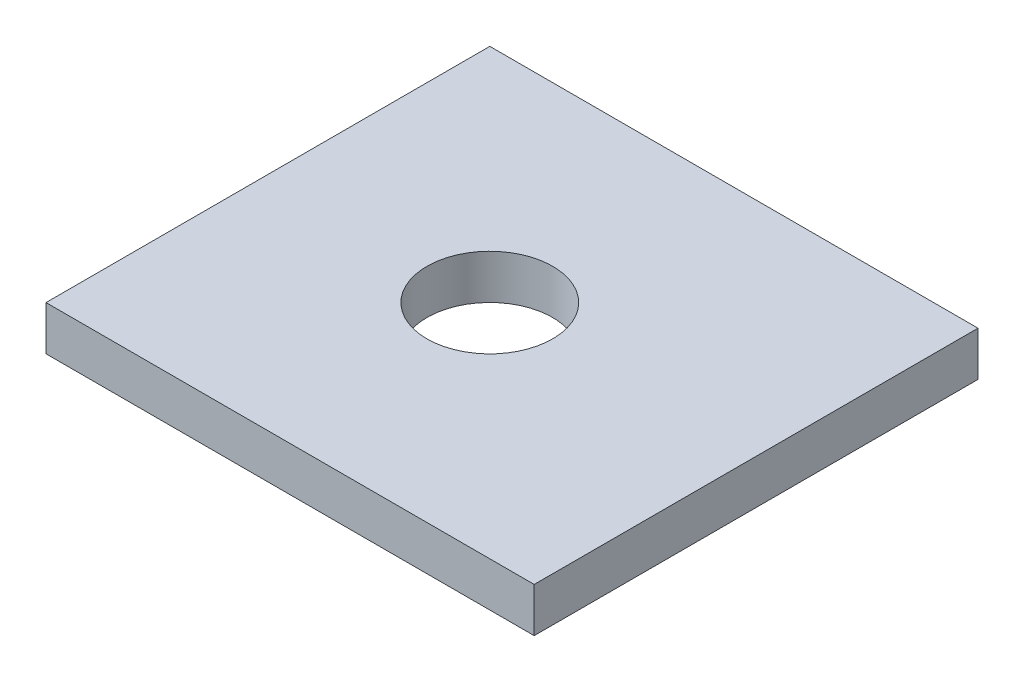
ISO-10303-21;
HEADER;
FILE_DESCRIPTION(('STEP AP214'),'2;1');
FILE_NAME('part.step','',(''),(''),'','','');
FILE_SCHEMA(('AUTOMOTIVE_DESIGN { 1 0 10303 214 1 1 1 1 }'));
ENDSEC;
DATA;
#1=APPLICATION_CONTEXT('core data for automotive mechanical design processes');
#2=APPLICATION_PROTOCOL_DEFINITION('international standard','automotive_design',2000,#1);
#3=PRODUCT_CONTEXT('',#1,'mechanical');
#4=PRODUCT('Part','Part','',(#3));
#5=PRODUCT_RELATED_PRODUCT_CATEGORY('part','',(#4));
#6=PRODUCT_DEFINITION_FORMATION('','',#4);
#7=PRODUCT_DEFINITION_CONTEXT('part definition',#1,'design');
#8=PRODUCT_DEFINITION('design','',#6,#7);
#9=PRODUCT_DEFINITION_SHAPE('','',#8);
#10=(LENGTH_UNIT() NAMED_UNIT(*) SI_UNIT(.MILLI.,.METRE.));
#11=(NAMED_UNIT(*) PLANE_ANGLE_UNIT() SI_UNIT($,.RADIAN.));
#12=(NAMED_UNIT(*) SI_UNIT($,.STERADIAN.) SOLID_ANGLE_UNIT());
#13=UNCERTAINTY_MEASURE_WITH_UNIT(LENGTH_MEASURE(1.E-05),#10,'distance_accuracy_value','');
#14=(GEOMETRIC_REPRESENTATION_CONTEXT(3) GLOBAL_UNCERTAINTY_ASSIGNED_CONTEXT((#13)) GLOBAL_UNIT_ASSIGNED_CONTEXT((#10,
#11,#12)) REPRESENTATION_CONTEXT('',''));
#15=CARTESIAN_POINT('',(0.,0.,0.));
#16=DIRECTION('',(0.,0.,1.));
#17=DIRECTION('',(1.,0.,0.));
#18=AXIS2_PLACEMENT_3D('',#15,#16,#17);
#19=CARTESIAN_POINT('',(16.5,3.,-15.));
#20=DIRECTION('',(-1.,0.,0.));
#21=DIRECTION('',(0.,0.,1.));
#22=AXIS2_PLACEMENT_3D('',#19,#20,#21);
#23=PLANE('',#22);
#24=DIRECTION('',(0.,0.,-1.));
#25=VECTOR('',#24,1.);
#26=CARTESIAN_POINT('',(16.5,0.,-15.));
#27=LINE('',#26,#25);
#28=CARTESIAN_POINT('',(16.5,0.,15.));
#29=VERTEX_POINT('',#28);
#30=CARTESIAN_POINT('',(16.5,0.,-15.));
#31=VERTEX_POINT('',#30);
#32=EDGE_CURVE('E107',#29,#31,#27,.T.);
#33=ORIENTED_EDGE('',*,*,#32,.T.);
#34=DIRECTION('',(0.,-1.,0.));
#35=VECTOR('',#34,1.);
#36=CARTESIAN_POINT('',(16.5,3.,-15.));
#37=LINE('',#36,#35);
#38=CARTESIAN_POINT('',(16.5,3.,-15.));
#39=VERTEX_POINT('',#38);
#40=EDGE_CURVE('E11',#39,#31,#37,.T.);
#41=ORIENTED_EDGE('',*,*,#40,.F.);
#42=DIRECTION('',(0.,0.,-1.));
#43=VECTOR('',#42,1.);
#44=CARTESIAN_POINT('',(16.5,3.,-15.));
#45=LINE('',#44,#43);
#46=CARTESIAN_POINT('',(16.5,3.,15.));
#47=VERTEX_POINT('',#46);
#48=EDGE_CURVE('E91',#47,#39,#45,.T.);
#49=ORIENTED_EDGE('',*,*,#48,.F.);
#50=DIRECTION('',(0.,-1.,0.));
#51=VECTOR('',#50,1.);
#52=CARTESIAN_POINT('',(16.5,3.,15.));
#53=LINE('',#52,#51);
#54=EDGE_CURVE('E103',#47,#29,#53,.T.);
#55=ORIENTED_EDGE('',*,*,#54,.T.);
#56=EDGE_LOOP('',(#33,#41,#49,#55));
#57=FACE_BOUND('',#56,.T.);
#58=ADVANCED_FACE('F39',(#57),#23,.F.);
#59=CARTESIAN_POINT('',(-16.5,3.,-15.));
#60=DIRECTION('',(0.,0.,1.));
#61=DIRECTION('',(1.,0.,0.));
#62=AXIS2_PLACEMENT_3D('',#59,#60,#61);
#63=PLANE('',#62);
#64=DIRECTION('',(-1.,0.,0.));
#65=VECTOR('',#64,1.);
#66=CARTESIAN_POINT('',(-16.5,0.,-15.));
#67=LINE('',#66,#65);
#68=CARTESIAN_POINT('',(-16.5,0.,-15.));
#69=VERTEX_POINT('',#68);
#70=EDGE_CURVE('E96',#31,#69,#67,.T.);
#71=ORIENTED_EDGE('',*,*,#70,.T.);
#72=DIRECTION('',(0.,-1.,0.));
#73=VECTOR('',#72,1.);
#74=CARTESIAN_POINT('',(-16.5,3.,-15.));
#75=LINE('',#74,#73);
#76=CARTESIAN_POINT('',(-16.5,3.,-15.));
#77=VERTEX_POINT('',#76);
#78=EDGE_CURVE('E48',#77,#69,#75,.T.);
#79=ORIENTED_EDGE('',*,*,#78,.F.);
#80=DIRECTION('',(-1.,0.,0.));
#81=VECTOR('',#80,1.);
#82=CARTESIAN_POINT('',(-16.5,3.,-15.));
#83=LINE('',#82,#81);
#84=EDGE_CURVE('E86',#39,#77,#83,.T.);
#85=ORIENTED_EDGE('',*,*,#84,.F.);
#86=ORIENTED_EDGE('',*,*,#40,.T.);
#87=EDGE_LOOP('',(#71,#79,#85,#86));
#88=FACE_BOUND('',#87,.T.);
#89=ADVANCED_FACE('F95',(#88),#63,.F.);
#90=CARTESIAN_POINT('',(-16.5,3.,-15.));
#91=DIRECTION('',(1.,0.,0.));
#92=DIRECTION('',(0.,0.,-1.));
#93=AXIS2_PLACEMENT_3D('',#90,#91,#92);
#94=PLANE('',#93);
#95=DIRECTION('',(0.,0.,1.));
#96=VECTOR('',#95,1.);
#97=CARTESIAN_POINT('',(-16.5,0.,-15.));
#98=LINE('',#97,#96);
#99=CARTESIAN_POINT('',(-16.5,0.,15.));
#100=VERTEX_POINT('',#99);
#101=EDGE_CURVE('E73',#69,#100,#98,.T.);
#102=ORIENTED_EDGE('',*,*,#101,.T.);
#103=DIRECTION('',(0.,-1.,0.));
#104=VECTOR('',#103,1.);
#105=CARTESIAN_POINT('',(-16.5,3.,15.));
#106=LINE('',#105,#104);
#107=CARTESIAN_POINT('',(-16.5,3.,15.));
#108=VERTEX_POINT('',#107);
#109=EDGE_CURVE('E98',#108,#100,#106,.T.);
#110=ORIENTED_EDGE('',*,*,#109,.F.);
#111=DIRECTION('',(0.,0.,1.));
#112=VECTOR('',#111,1.);
#113=CARTESIAN_POINT('',(-16.5,3.,-15.));
#114=LINE('',#113,#112);
#115=EDGE_CURVE('E89',#77,#108,#114,.T.);
#116=ORIENTED_EDGE('',*,*,#115,.F.);
#117=ORIENTED_EDGE('',*,*,#78,.T.);
#118=EDGE_LOOP('',(#102,#110,#116,#117));
#119=FACE_BOUND('',#118,.T.);
#120=ADVANCED_FACE('F99',(#119),#94,.F.);
#121=CARTESIAN_POINT('',(-16.5,3.,15.));
#122=DIRECTION('',(0.,0.,-1.));
#123=DIRECTION('',(-1.,0.,0.));
#124=AXIS2_PLACEMENT_3D('',#121,#122,#123);
#125=PLANE('',#124);
#126=DIRECTION('',(1.,0.,0.));
#127=VECTOR('',#126,1.);
#128=CARTESIAN_POINT('',(-16.5,0.,15.));
#129=LINE('',#128,#127);
#130=EDGE_CURVE('E79',#100,#29,#129,.T.);
#131=ORIENTED_EDGE('',*,*,#130,.T.);
#132=ORIENTED_EDGE('',*,*,#54,.F.);
#133=DIRECTION('',(1.,0.,0.));
#134=VECTOR('',#133,1.);
#135=CARTESIAN_POINT('',(-16.5,3.,15.));
#136=LINE('',#135,#134);
#137=EDGE_CURVE('E56',#108,#47,#136,.T.);
#138=ORIENTED_EDGE('',*,*,#137,.F.);
#139=ORIENTED_EDGE('',*,*,#109,.T.);
#140=EDGE_LOOP('',(#131,#132,#138,#139));
#141=FACE_BOUND('',#140,.T.);
#142=ADVANCED_FACE('F121',(#141),#125,.F.);
#143=CARTESIAN_POINT('',(0.,3.,0.));
#144=DIRECTION('',(0.,1.,0.));
#145=DIRECTION('',(0.,0.,1.));
#146=AXIS2_PLACEMENT_3D('',#143,#144,#145);
#147=PLANE('',#146);
#148=CARTESIAN_POINT('',(-1.5,3.,0.));
#149=DIRECTION('',(0.,1.,0.));
#150=DIRECTION('',(0.,0.,1.));
#151=AXIS2_PLACEMENT_3D('',#148,#149,#150);
#152=CIRCLE('',#151,4.25);
#153=CARTESIAN_POINT('',(-1.5,3.,4.25));
#154=VERTEX_POINT('',#153);
#155=EDGE_CURVE('E128',#154,#154,#152,.T.);
#156=ORIENTED_EDGE('',*,*,#155,.F.);
#157=EDGE_LOOP('',(#156));
#158=FACE_BOUND('',#157,.T.);
#159=ORIENTED_EDGE('',*,*,#48,.T.);
#160=ORIENTED_EDGE('',*,*,#84,.T.);
#161=ORIENTED_EDGE('',*,*,#115,.T.);
#162=ORIENTED_EDGE('',*,*,#137,.T.);
#163=EDGE_LOOP('',(#159,#160,#161,#162));
#164=FACE_BOUND('',#163,.T.);
#165=ADVANCED_FACE('F87',(#158,#164),#147,.T.);
#166=CARTESIAN_POINT('',(0.,0.,0.));
#167=DIRECTION('',(0.,1.,0.));
#168=DIRECTION('',(0.,0.,1.));
#169=AXIS2_PLACEMENT_3D('',#166,#167,#168);
#170=PLANE('',#169);
#171=CARTESIAN_POINT('',(-1.5,0.,0.));
#172=DIRECTION('',(0.,1.,0.));
#173=DIRECTION('',(0.,0.,1.));
#174=AXIS2_PLACEMENT_3D('',#171,#172,#173);
#175=CIRCLE('',#174,4.25);
#176=CARTESIAN_POINT('',(-1.5,0.,4.25));
#177=VERTEX_POINT('',#176);
#178=EDGE_CURVE('E111',#177,#177,#175,.T.);
#179=ORIENTED_EDGE('',*,*,#178,.T.);
#180=EDGE_LOOP('',(#179));
#181=FACE_BOUND('',#180,.T.);
#182=ORIENTED_EDGE('',*,*,#32,.F.);
#183=ORIENTED_EDGE('',*,*,#130,.F.);
#184=ORIENTED_EDGE('',*,*,#101,.F.);
#185=ORIENTED_EDGE('',*,*,#70,.F.);
#186=EDGE_LOOP('',(#182,#183,#184,#185));
#187=FACE_BOUND('',#186,.T.);
#188=ADVANCED_FACE('F124',(#181,#187),#170,.F.);
#189=CARTESIAN_POINT('',(-1.5,0.,0.));
#190=DIRECTION('',(0.,1.,0.));
#191=DIRECTION('',(0.,0.,1.));
#192=AXIS2_PLACEMENT_3D('',#189,#190,#191);
#193=CYLINDRICAL_SURFACE('',#192,4.25);
#194=ORIENTED_EDGE('',*,*,#178,.F.);
#195=EDGE_LOOP('',(#194));
#196=FACE_BOUND('',#195,.T.);
#197=ORIENTED_EDGE('',*,*,#155,.T.);
#198=EDGE_LOOP('',(#197));
#199=FACE_BOUND('',#198,.T.);
#200=ADVANCED_FACE('F137',(#196,#199),#193,.F.);
#201=CLOSED_SHELL('',(#58,#89,#120,#142,#165,#188,#200));
#202=MANIFOLD_SOLID_BREP('B2',#201);
#203=ADVANCED_BREP_SHAPE_REPRESENTATION('',(#18,#202),#14);
#204=SHAPE_DEFINITION_REPRESENTATION(#9,#203);
ENDSEC;
END-ISO-10303-21;
